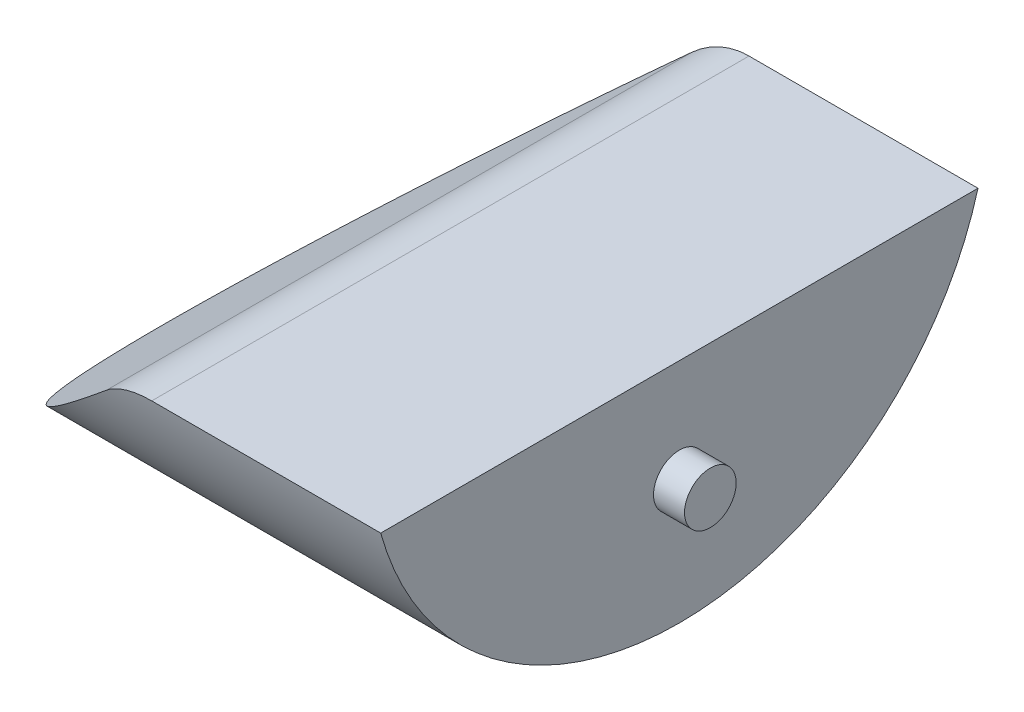
ISO-10303-21;
HEADER;
FILE_DESCRIPTION(('STEP AP214'),'2;1');
FILE_NAME('part.step','',(''),(''),'','','');
FILE_SCHEMA(('AUTOMOTIVE_DESIGN { 1 0 10303 214 1 1 1 1 }'));
ENDSEC;
DATA;
#1=APPLICATION_CONTEXT('core data for automotive mechanical design processes');
#2=APPLICATION_PROTOCOL_DEFINITION('international standard','automotive_design',2000,#1);
#3=PRODUCT_CONTEXT('',#1,'mechanical');
#4=PRODUCT('Part','Part','',(#3));
#5=PRODUCT_RELATED_PRODUCT_CATEGORY('part','',(#4));
#6=PRODUCT_DEFINITION_FORMATION('','',#4);
#7=PRODUCT_DEFINITION_CONTEXT('part definition',#1,'design');
#8=PRODUCT_DEFINITION('design','',#6,#7);
#9=PRODUCT_DEFINITION_SHAPE('','',#8);
#10=(LENGTH_UNIT() NAMED_UNIT(*) SI_UNIT(.MILLI.,.METRE.));
#11=(NAMED_UNIT(*) PLANE_ANGLE_UNIT() SI_UNIT($,.RADIAN.));
#12=(NAMED_UNIT(*) SI_UNIT($,.STERADIAN.) SOLID_ANGLE_UNIT());
#13=UNCERTAINTY_MEASURE_WITH_UNIT(LENGTH_MEASURE(1.E-05),#10,'distance_accuracy_value','');
#14=(GEOMETRIC_REPRESENTATION_CONTEXT(3) GLOBAL_UNCERTAINTY_ASSIGNED_CONTEXT((#13)) GLOBAL_UNIT_ASSIGNED_CONTEXT((#10,
#11,#12)) REPRESENTATION_CONTEXT('',''));
#15=CARTESIAN_POINT('',(0.,0.,0.));
#16=DIRECTION('',(0.,0.,1.));
#17=DIRECTION('',(1.,0.,0.));
#18=AXIS2_PLACEMENT_3D('',#15,#16,#17);
#19=CARTESIAN_POINT('',(0.,0.,0.));
#20=DIRECTION('',(1.,0.,0.));
#21=DIRECTION('',(0.,0.,-1.));
#22=AXIS2_PLACEMENT_3D('',#19,#20,#21);
#23=PLANE('',#22);
#24=CARTESIAN_POINT('',(0.,-45.72,0.));
#25=DIRECTION('',(1.,0.,0.));
#26=DIRECTION('',(0.,0.,-1.));
#27=AXIS2_PLACEMENT_3D('',#24,#25,#26);
#28=CIRCLE('',#27,6.35);
#29=CARTESIAN_POINT('',(0.,-45.72,6.35));
#30=VERTEX_POINT('',#29);
#31=EDGE_CURVE('E98',#30,#30,#28,.T.);
#32=ORIENTED_EDGE('',*,*,#31,.F.);
#33=EDGE_LOOP('',(#32));
#34=FACE_BOUND('',#33,.T.);
#35=DIRECTION('',(0.,0.,1.));
#36=VECTOR('',#35,1.);
#37=CARTESIAN_POINT('',(0.,-20.32,73.4407080575889));
#38=LINE('',#37,#36);
#39=CARTESIAN_POINT('',(0.,-20.32,-73.4407080575889));
#40=VERTEX_POINT('',#39);
#41=CARTESIAN_POINT('',(0.,-20.32,73.4407080575889));
#42=VERTEX_POINT('',#41);
#43=EDGE_CURVE('E80',#40,#42,#38,.T.);
#44=ORIENTED_EDGE('',*,*,#43,.T.);
#45=CARTESIAN_POINT('',(0.,0.,0.));
#46=DIRECTION('',(1.,0.,0.));
#47=DIRECTION('',(0.,0.,-1.));
#48=AXIS2_PLACEMENT_3D('',#45,#46,#47);
#49=CIRCLE('',#48,76.2);
#50=EDGE_CURVE('E86',#42,#40,#49,.T.);
#51=ORIENTED_EDGE('',*,*,#50,.T.);
#52=EDGE_LOOP('',(#44,#51));
#53=FACE_BOUND('',#52,.T.);
#54=ADVANCED_FACE('F45',(#34,#53),#23,.T.);
#55=CARTESIAN_POINT('',(127.,0.,0.));
#56=DIRECTION('',(-1.,0.,0.));
#57=DIRECTION('',(0.,0.,1.));
#58=AXIS2_PLACEMENT_3D('',#55,#56,#57);
#59=CYLINDRICAL_SURFACE('',#58,76.2);
#60=ORIENTED_EDGE('',*,*,#50,.F.);
#61=DIRECTION('',(-1.,0.,0.));
#62=VECTOR('',#61,1.);
#63=CARTESIAN_POINT('',(127.,-20.32,73.4407080575889));
#64=LINE('',#63,#62);
#65=CARTESIAN_POINT('',(-56.3115244007405,-20.32,73.4407080575889));
#66=VERTEX_POINT('',#65);
#67=EDGE_CURVE('E49',#42,#66,#64,.T.);
#68=ORIENTED_EDGE('',*,*,#67,.T.);
#69=CARTESIAN_POINT('',(-56.3115244007405,-20.32,73.4407080575889));
#70=CARTESIAN_POINT('',(-56.5700300316653,-20.3199991554033,73.4407063359609));
#71=CARTESIAN_POINT('',(-56.8285068692523,-20.3252625194358,73.439252230246));
#72=CARTESIAN_POINT('',(-57.3449933709856,-20.3462977918162,73.4334279449559));
#73=CARTESIAN_POINT('',(-57.6030030463425,-20.3620694445554,73.4290578363111));
#74=CARTESIAN_POINT('',(-58.3756196292876,-20.4251079297358,73.4115590749349));
#75=CARTESIAN_POINT('',(-58.8889310985459,-20.4880983076444,73.3940419959211));
#76=CARTESIAN_POINT('',(-59.9085459181511,-20.6555396830979,73.3470942027149));
#77=CARTESIAN_POINT('',(-60.4148443763769,-20.7600182495076,73.3176555664));
#78=CARTESIAN_POINT('',(-61.1659162184489,-20.9470794237377,73.2643432188116));
#79=CARTESIAN_POINT('',(-61.4148825050259,-21.0144920494826,73.2450462183593));
#80=CARTESIAN_POINT('',(-61.9096992011996,-21.1593050646107,73.2033434518041));
#81=CARTESIAN_POINT('',(-62.1555487973612,-21.2367080047689,73.180936891643));
#82=CARTESIAN_POINT('',(-62.8879148651463,-21.4837192599353,73.1089553677631));
#83=CARTESIAN_POINT('',(-63.3690781785711,-21.6680874998351,73.0546305428251));
#84=CARTESIAN_POINT('',(-64.3135040794081,-22.0744775645498,72.9328620778276));
#85=CARTESIAN_POINT('',(-64.776766727245,-22.2964992622499,72.8654184820558));
#86=CARTESIAN_POINT('',(-65.4553064640745,-22.655959058814,72.7541282211962));
#87=CARTESIAN_POINT('',(-65.6785787479972,-22.7800674413941,72.7153810237203));
#88=CARTESIAN_POINT('',(-66.1194358324064,-23.0368299196799,72.6344449693006));
#89=CARTESIAN_POINT('',(-66.3370219237689,-23.1694820516767,72.5922569026222));
#90=CARTESIAN_POINT('',(-66.9806094084258,-23.5797588645024,72.4604543853985));
#91=CARTESIAN_POINT('',(-67.3977311739668,-23.869858442782,72.3655541843622));
#92=CARTESIAN_POINT('',(-67.9900014033369,-24.317701229711,72.2157325643111));
#93=CARTESIAN_POINT('',(-68.1756868803434,-24.4636329764667,72.1664429477341));
#94=CARTESIAN_POINT('',(-68.5407785815588,-24.7616711283959,72.0647237133339));
#95=CARTESIAN_POINT('',(-68.7201917406196,-24.9137702849992,72.012297749068));
#96=CARTESIAN_POINT('',(-68.8964857984336,-25.0689075026215,71.9582509280556));
#97=B_SPLINE_CURVE_WITH_KNOTS('',3,(#69,#70,#71,#72,#73,#74,#75,#76,#77,#78,#79,#80,#81,#82,#83,
#84,#85,#86,#87,#88,#89,#90,#91,#92,#93,#94,#95,#96),.UNSPECIFIED.,.F.,.F.,(4,2,2,2,2,2,2,2,2,2,
2,2,2,4),(0.,0.775401755467531,1.55078465037206,3.10120056928607,4.65264846686548,
5.42840398235091,6.20435796075181,7.75679239890763,9.30922159628543,10.084126672802,
10.8588542751337,12.4073134809147,13.1309404636671,13.8537403093022),.UNSPECIFIED.);
#98=CARTESIAN_POINT('',(-68.8964857984335,-25.0689075026215,71.9582509280555));
#99=VERTEX_POINT('',#98);
#100=EDGE_CURVE('E64',#66,#99,#97,.T.);
#101=ORIENTED_EDGE('',*,*,#100,.T.);
#102=CARTESIAN_POINT('',(-40.4090909090909,0.,0.));
#103=DIRECTION('',(0.660627894892025,-0.750713516922755,0.));
#104=DIRECTION('',(-0.750713516922755,-0.660627894892025,0.));
#105=AXIS2_PLACEMENT_3D('',#102,#103,#104);
#106=ELLIPSE('',#105,115.344811487947,76.2);
#107=CARTESIAN_POINT('',(-68.8964857984335,-25.0689075026215,-71.9582509280555));
#108=VERTEX_POINT('',#107);
#109=EDGE_CURVE('E11',#99,#108,#106,.T.);
#110=ORIENTED_EDGE('',*,*,#109,.T.);
#111=CARTESIAN_POINT('',(-68.8964857984335,-25.0689075026215,-71.9582509280555));
#112=CARTESIAN_POINT('',(-68.7064542501679,-24.9016785081498,-72.0165103712882));
#113=CARTESIAN_POINT('',(-68.5127854519955,-24.7379734106293,-72.0728884396596));
#114=CARTESIAN_POINT('',(-68.118430385301,-24.417944457579,-72.1819407291992));
#115=CARTESIAN_POINT('',(-67.9177440441064,-24.2616206785282,-72.2346149119936));
#116=CARTESIAN_POINT('',(-67.305615092634,-23.8042750176876,-72.3871520859349));
#117=CARTESIAN_POINT('',(-66.8840420341254,-23.5148254865147,-72.4815481690505));
#118=CARTESIAN_POINT('',(-66.0162823982986,-22.969289875495,-72.6562726062024));
#119=CARTESIAN_POINT('',(-65.5700619251986,-22.7132514556661,-72.7365809194179));
#120=CARTESIAN_POINT('',(-64.6565907722593,-22.2373547959698,-72.8834829377334));
#121=CARTESIAN_POINT('',(-64.1893418060932,-22.0174936146887,-72.9500777579288));
#122=CARTESIAN_POINT('',(-63.2366164349324,-21.6157567148279,-73.0701244943568));
#123=CARTESIAN_POINT('',(-62.751122593231,-21.4339184832271,-73.1235634492858));
#124=CARTESIAN_POINT('',(-61.7657137088763,-21.1101173924322,-73.2176987135927));
#125=CARTESIAN_POINT('',(-61.2657962544859,-20.9681612449332,-73.2583928783014));
#126=CARTESIAN_POINT('',(-60.2564618946426,-20.7257313441812,-73.3273476315661));
#127=CARTESIAN_POINT('',(-59.7470707423129,-20.6251585940407,-73.3556379033363));
#128=CARTESIAN_POINT('',(-58.7214840405937,-20.4659362421299,-73.4002203277552));
#129=CARTESIAN_POINT('',(-58.2052925881303,-20.4072624774118,-73.4165193958391));
#130=CARTESIAN_POINT('',(-57.4585424680954,-20.3531744547465,-73.4315226030949));
#131=CARTESIAN_POINT('',(-57.2291968767097,-20.3407293276696,-73.4349700272801));
#132=CARTESIAN_POINT('',(-56.7704180495646,-20.3241466960878,-73.4395609779635));
#133=CARTESIAN_POINT('',(-56.5409851449127,-20.3200006846576,-73.4407068636348));
#134=CARTESIAN_POINT('',(-56.3115244007405,-20.32,-73.4407080575889));
#135=B_SPLINE_CURVE_WITH_KNOTS('',3,(#111,#112,#113,#114,#115,#116,#117,#118,#119,#120,#121,
#122,#123,#124,#125,#126,#127,#128,#129,#130,#131,#132,#133,#134),.UNSPECIFIED.,.F.,.F.,(4,2,2,
2,2,2,2,2,2,2,2,4),(0.,0.779143026024587,1.55829412311675,3.11634885558901,4.67660236416526,
6.23672895257011,7.79838649844047,9.36030669607526,10.9184684540224,12.475730900133,
13.1647238035012,13.853010099203),.UNSPECIFIED.);
#136=CARTESIAN_POINT('',(-56.3115244007405,-20.32,-73.4407080575889));
#137=VERTEX_POINT('',#136);
#138=EDGE_CURVE('E101',#108,#137,#135,.T.);
#139=ORIENTED_EDGE('',*,*,#138,.T.);
#140=DIRECTION('',(-1.,0.,0.));
#141=VECTOR('',#140,1.);
#142=CARTESIAN_POINT('',(127.,-20.32,-73.4407080575889));
#143=LINE('',#142,#141);
#144=EDGE_CURVE('E84',#40,#137,#143,.T.);
#145=ORIENTED_EDGE('',*,*,#144,.F.);
#146=EDGE_LOOP('',(#60,#68,#101,#110,#139,#145));
#147=FACE_BOUND('',#146,.T.);
#148=ADVANCED_FACE('F87',(#147),#59,.T.);
#149=CARTESIAN_POINT('',(127.,-20.32,73.4407080575889));
#150=DIRECTION('',(0.,-1.,0.));
#151=DIRECTION('',(0.,0.,-1.));
#152=AXIS2_PLACEMENT_3D('',#149,#150,#151);
#153=PLANE('',#152);
#154=ORIENTED_EDGE('',*,*,#43,.F.);
#155=ORIENTED_EDGE('',*,*,#144,.T.);
#156=DIRECTION('',(0.,0.,1.));
#157=VECTOR('',#156,1.);
#158=CARTESIAN_POINT('',(-56.3115244007405,-20.32,73.4407080575889));
#159=LINE('',#158,#157);
#160=EDGE_CURVE('E82',#137,#66,#159,.T.);
#161=ORIENTED_EDGE('',*,*,#160,.T.);
#162=ORIENTED_EDGE('',*,*,#67,.F.);
#163=EDGE_LOOP('',(#154,#155,#161,#162));
#164=FACE_BOUND('',#163,.T.);
#165=ADVANCED_FACE('F47',(#164),#153,.F.);
#166=CARTESIAN_POINT('',(-127.,-76.2,-73.4407080575889));
#167=DIRECTION('',(0.660627894892025,-0.750713516922755,0.));
#168=DIRECTION('',(0.750713516922755,0.660627894892025,0.));
#169=AXIS2_PLACEMENT_3D('',#166,#167,#168);
#170=PLANE('',#169);
#171=ORIENTED_EDGE('',*,*,#109,.F.);
#172=DIRECTION('',(0.,0.,1.));
#173=VECTOR('',#172,1.);
#174=CARTESIAN_POINT('',(-68.8964857984335,-25.0689075026215,-73.4407080575889));
#175=LINE('',#174,#173);
#176=EDGE_CURVE('E91',#99,#108,#175,.F.);
#177=ORIENTED_EDGE('',*,*,#176,.T.);
#178=EDGE_LOOP('',(#171,#177));
#179=FACE_BOUND('',#178,.T.);
#180=ADVANCED_FACE('F128',(#179),#170,.F.);
#181=CARTESIAN_POINT('',(-56.3115244007405,-39.37,73.4407080575889));
#182=DIRECTION('',(0.,0.,1.));
#183=DIRECTION('',(1.,0.,0.));
#184=AXIS2_PLACEMENT_3D('',#181,#182,#183);
#185=CYLINDRICAL_SURFACE('',#184,19.05);
#186=ORIENTED_EDGE('',*,*,#138,.F.);
#187=ORIENTED_EDGE('',*,*,#176,.F.);
#188=ORIENTED_EDGE('',*,*,#100,.F.);
#189=ORIENTED_EDGE('',*,*,#160,.F.);
#190=EDGE_LOOP('',(#186,#187,#188,#189));
#191=FACE_BOUND('',#190,.T.);
#192=ADVANCED_FACE('F117',(#191),#185,.T.);
#193=CARTESIAN_POINT('',(7.62,-45.72,0.));
#194=DIRECTION('',(-1.,0.,0.));
#195=DIRECTION('',(0.,0.,1.));
#196=AXIS2_PLACEMENT_3D('',#193,#194,#195);
#197=CYLINDRICAL_SURFACE('',#196,6.35);
#198=CARTESIAN_POINT('',(7.62,-45.72,0.));
#199=DIRECTION('',(1.,0.,0.));
#200=DIRECTION('',(0.,0.,-1.));
#201=AXIS2_PLACEMENT_3D('',#198,#199,#200);
#202=CIRCLE('',#201,6.35);
#203=CARTESIAN_POINT('',(7.62,-45.72,6.35));
#204=VERTEX_POINT('',#203);
#205=EDGE_CURVE('E94',#204,#204,#202,.T.);
#206=CARTESIAN_POINT('',(7.62,-45.72,6.35));
#207=CARTESIAN_POINT('',(7.540625,-45.72,6.35));
#208=CARTESIAN_POINT('',(7.46125,-45.72,6.35));
#209=CARTESIAN_POINT('',(7.3025,-45.72,6.35));
#210=CARTESIAN_POINT('',(7.223125,-45.72,6.35));
#211=CARTESIAN_POINT('',(7.064375,-45.72,6.35));
#212=CARTESIAN_POINT('',(6.985,-45.72,6.35));
#213=CARTESIAN_POINT('',(6.82625,-45.72,6.35));
#214=CARTESIAN_POINT('',(6.746875,-45.72,6.35));
#215=CARTESIAN_POINT('',(6.588125,-45.72,6.35));
#216=CARTESIAN_POINT('',(6.50875,-45.72,6.35));
#217=CARTESIAN_POINT('',(6.35,-45.72,6.35));
#218=CARTESIAN_POINT('',(6.270625,-45.72,6.35));
#219=CARTESIAN_POINT('',(6.111875,-45.72,6.35));
#220=CARTESIAN_POINT('',(6.0325,-45.72,6.35));
#221=CARTESIAN_POINT('',(5.87375,-45.72,6.35));
#222=CARTESIAN_POINT('',(5.794375,-45.72,6.35));
#223=CARTESIAN_POINT('',(5.635625,-45.72,6.35));
#224=CARTESIAN_POINT('',(5.55625,-45.72,6.35));
#225=CARTESIAN_POINT('',(5.3975,-45.72,6.35));
#226=CARTESIAN_POINT('',(5.318125,-45.72,6.35));
#227=CARTESIAN_POINT('',(5.159375,-45.72,6.35));
#228=CARTESIAN_POINT('',(5.08,-45.72,6.35));
#229=CARTESIAN_POINT('',(4.92125,-45.72,6.35));
#230=CARTESIAN_POINT('',(4.841875,-45.72,6.35));
#231=CARTESIAN_POINT('',(4.683125,-45.72,6.35));
#232=CARTESIAN_POINT('',(4.60375,-45.72,6.35));
#233=CARTESIAN_POINT('',(4.445,-45.72,6.35));
#234=CARTESIAN_POINT('',(4.365625,-45.72,6.35));
#235=CARTESIAN_POINT('',(4.206875,-45.72,6.35));
#236=CARTESIAN_POINT('',(4.1275,-45.72,6.35));
#237=CARTESIAN_POINT('',(3.96875,-45.72,6.35));
#238=CARTESIAN_POINT('',(3.889375,-45.72,6.35));
#239=CARTESIAN_POINT('',(3.730625,-45.72,6.35));
#240=CARTESIAN_POINT('',(3.65125,-45.72,6.35));
#241=CARTESIAN_POINT('',(3.4925,-45.72,6.35));
#242=CARTESIAN_POINT('',(3.413125,-45.72,6.35));
#243=CARTESIAN_POINT('',(3.254375,-45.72,6.35));
#244=CARTESIAN_POINT('',(3.175,-45.72,6.35));
#245=CARTESIAN_POINT('',(3.01625,-45.72,6.35));
#246=CARTESIAN_POINT('',(2.936875,-45.72,6.35));
#247=CARTESIAN_POINT('',(2.778125,-45.72,6.35));
#248=CARTESIAN_POINT('',(2.69875,-45.72,6.35));
#249=CARTESIAN_POINT('',(2.54,-45.72,6.35));
#250=CARTESIAN_POINT('',(2.460625,-45.72,6.35));
#251=CARTESIAN_POINT('',(2.301875,-45.72,6.35));
#252=CARTESIAN_POINT('',(2.2225,-45.72,6.35));
#253=CARTESIAN_POINT('',(2.06375,-45.72,6.35));
#254=CARTESIAN_POINT('',(1.984375,-45.72,6.35));
#255=CARTESIAN_POINT('',(1.825625,-45.72,6.35));
#256=CARTESIAN_POINT('',(1.74625,-45.72,6.35));
#257=CARTESIAN_POINT('',(1.5875,-45.72,6.35));
#258=CARTESIAN_POINT('',(1.508125,-45.72,6.35));
#259=CARTESIAN_POINT('',(1.349375,-45.72,6.35));
#260=CARTESIAN_POINT('',(1.27,-45.72,6.35));
#261=CARTESIAN_POINT('',(1.11125,-45.72,6.35));
#262=CARTESIAN_POINT('',(1.031875,-45.72,6.35));
#263=CARTESIAN_POINT('',(0.873125,-45.72,6.35));
#264=CARTESIAN_POINT('',(0.79375,-45.72,6.35));
#265=CARTESIAN_POINT('',(0.635,-45.72,6.35));
#266=CARTESIAN_POINT('',(0.555625,-45.72,6.35));
#267=CARTESIAN_POINT('',(0.396875,-45.72,6.35));
#268=CARTESIAN_POINT('',(0.3175,-45.72,6.35));
#269=CARTESIAN_POINT('',(0.15875,-45.72,6.35));
#270=CARTESIAN_POINT('',(0.0793749999999999,-45.72,6.35));
#271=CARTESIAN_POINT('',(0.,-45.72,6.35));
#272=B_SPLINE_CURVE_WITH_KNOTS('',3,(#206,#207,#208,#209,#210,#211,#212,#213,#214,#215,#216,
#217,#218,#219,#220,#221,#222,#223,#224,#225,#226,#227,#228,#229,#230,#231,#232,#233,#234,#235,
#236,#237,#238,#239,#240,#241,#242,#243,#244,#245,#246,#247,#248,#249,#250,#251,#252,#253,#254,
#255,#256,#257,#258,#259,#260,#261,#262,#263,#264,#265,#266,#267,#268,#269,#270,#271),
.UNSPECIFIED.,.F.,.F.,(4,2,2,2,2,2,2,2,2,2,2,2,2,2,2,2,2,2,2,2,2,2,2,2,2,2,2,2,2,2,2,2,4),(0.,
0.238125,0.476249999999999,0.714375,0.952499999999999,1.190625,1.42875,1.666875,1.905,2.143125,
2.38125,2.619375,2.8575,3.095625,3.33375,3.571875,3.81,4.048125,4.28625,4.524375,4.7625,
5.000625,5.23875,5.476875,5.715,5.953125,6.19125,6.429375,6.6675,6.905625,7.14375,7.381875,
7.62),.UNSPECIFIED.);
#273=EDGE_CURVE('BSEAM127',#204,#30,#272,.T.);
#274=ORIENTED_EDGE('',*,*,#205,.F.);
#275=ORIENTED_EDGE('',*,*,#31,.T.);
#276=ORIENTED_EDGE('',*,*,#273,.T.);
#277=ORIENTED_EDGE('',*,*,#273,.F.);
#278=EDGE_LOOP('',(#274,#276,#275,#277));
#279=FACE_BOUND('',#278,.T.);
#280=ADVANCED_FACE('F127',(#279),#197,.T.);
#281=CARTESIAN_POINT('',(7.62,-45.72,0.));
#282=DIRECTION('',(1.,0.,0.));
#283=DIRECTION('',(0.,0.,-1.));
#284=AXIS2_PLACEMENT_3D('',#281,#282,#283);
#285=PLANE('',#284);
#286=ORIENTED_EDGE('',*,*,#205,.T.);
#287=EDGE_LOOP('',(#286));
#288=FACE_BOUND('',#287,.T.);
#289=ADVANCED_FACE('F146',(#288),#285,.T.);
#290=CLOSED_SHELL('',(#54,#148,#165,#180,#192,#280,#289));
#291=MANIFOLD_SOLID_BREP('B2',#290);
#292=ADVANCED_BREP_SHAPE_REPRESENTATION('',(#18,#291),#14);
#293=SHAPE_DEFINITION_REPRESENTATION(#9,#292);
ENDSEC;
END-ISO-10303-21;
